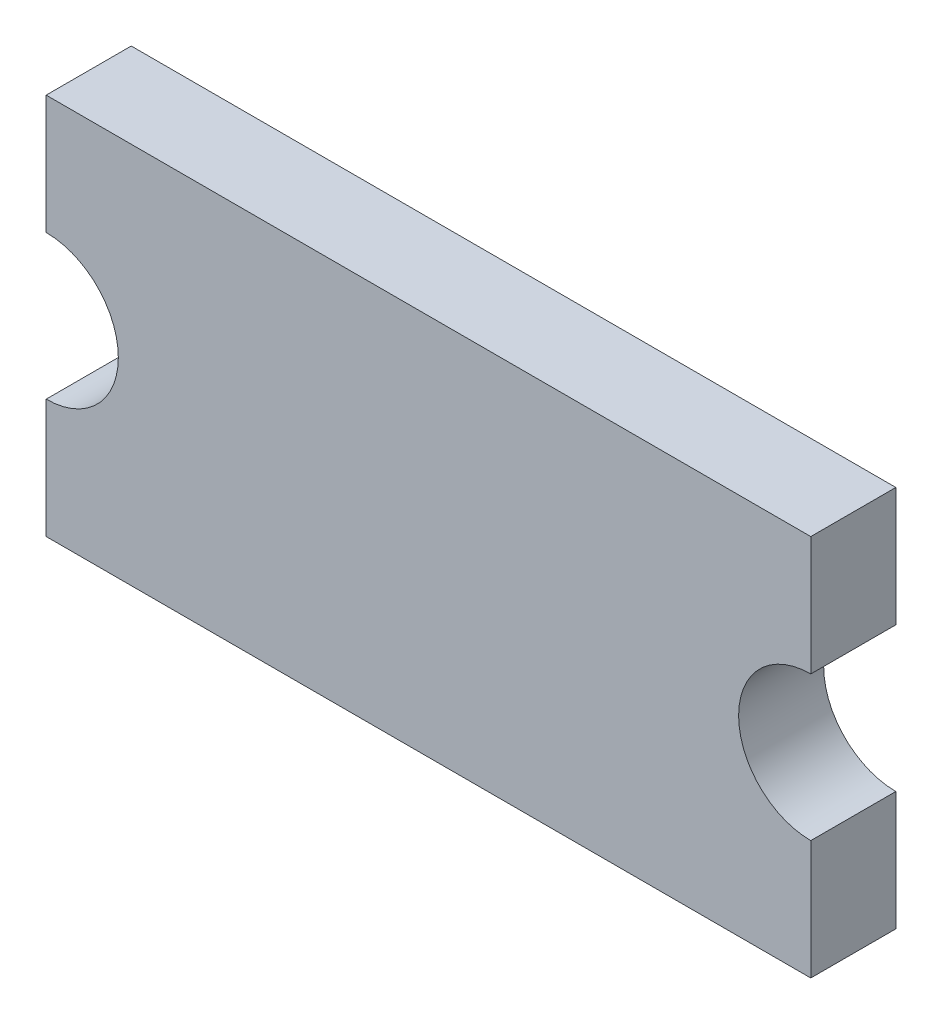
ISO-10303-21;
HEADER;
FILE_DESCRIPTION(('STEP AP214'),'2;1');
FILE_NAME('part.step','',(''),(''),'','','');
FILE_SCHEMA(('AUTOMOTIVE_DESIGN { 1 0 10303 214 1 1 1 1 }'));
ENDSEC;
DATA;
#1=APPLICATION_CONTEXT('core data for automotive mechanical design processes');
#2=APPLICATION_PROTOCOL_DEFINITION('international standard','automotive_design',2000,#1);
#3=PRODUCT_CONTEXT('',#1,'mechanical');
#4=PRODUCT('Part','Part','',(#3));
#5=PRODUCT_RELATED_PRODUCT_CATEGORY('part','',(#4));
#6=PRODUCT_DEFINITION_FORMATION('','',#4);
#7=PRODUCT_DEFINITION_CONTEXT('part definition',#1,'design');
#8=PRODUCT_DEFINITION('design','',#6,#7);
#9=PRODUCT_DEFINITION_SHAPE('','',#8);
#10=(LENGTH_UNIT() NAMED_UNIT(*) SI_UNIT(.MILLI.,.METRE.));
#11=(NAMED_UNIT(*) PLANE_ANGLE_UNIT() SI_UNIT($,.RADIAN.));
#12=(NAMED_UNIT(*) SI_UNIT($,.STERADIAN.) SOLID_ANGLE_UNIT());
#13=UNCERTAINTY_MEASURE_WITH_UNIT(LENGTH_MEASURE(1.E-05),#10,'distance_accuracy_value','');
#14=(GEOMETRIC_REPRESENTATION_CONTEXT(3) GLOBAL_UNCERTAINTY_ASSIGNED_CONTEXT((#13)) GLOBAL_UNIT_ASSIGNED_CONTEXT((#10,
#11,#12)) REPRESENTATION_CONTEXT('',''));
#15=CARTESIAN_POINT('',(0.,0.,0.));
#16=DIRECTION('',(0.,0.,1.));
#17=DIRECTION('',(1.,0.,0.));
#18=AXIS2_PLACEMENT_3D('',#15,#16,#17);
#19=CARTESIAN_POINT('',(0.,0.,0.178));
#20=DIRECTION('',(0.,0.,1.));
#21=DIRECTION('',(1.,0.,0.));
#22=AXIS2_PLACEMENT_3D('',#19,#20,#21);
#23=PLANE('',#22);
#24=DIRECTION('',(-1.,0.,0.));
#25=VECTOR('',#24,1.);
#26=CARTESIAN_POINT('',(-0.8,0.4,0.178));
#27=LINE('',#26,#25);
#28=CARTESIAN_POINT('',(0.8,0.4,0.178));
#29=VERTEX_POINT('',#28);
#30=CARTESIAN_POINT('',(-0.8,0.4,0.178));
#31=VERTEX_POINT('',#30);
#32=EDGE_CURVE('E11',#29,#31,#27,.T.);
#33=ORIENTED_EDGE('',*,*,#32,.T.);
#34=DIRECTION('',(0.,-1.,0.));
#35=VECTOR('',#34,1.);
#36=CARTESIAN_POINT('',(-0.8,0.151,0.178));
#37=LINE('',#36,#35);
#38=CARTESIAN_POINT('',(-0.8,0.151,0.178));
#39=VERTEX_POINT('',#38);
#40=EDGE_CURVE('E187',#31,#39,#37,.T.);
#41=ORIENTED_EDGE('',*,*,#40,.T.);
#42=CARTESIAN_POINT('',(-0.8,0.,0.178));
#43=DIRECTION('',(0.,0.,-1.));
#44=DIRECTION('',(0.,-1.,0.));
#45=AXIS2_PLACEMENT_3D('',#42,#43,#44);
#46=CIRCLE('',#45,0.151);
#47=CARTESIAN_POINT('',(-0.8,-0.151,0.178));
#48=VERTEX_POINT('',#47);
#49=EDGE_CURVE('E128',#39,#48,#46,.T.);
#50=ORIENTED_EDGE('',*,*,#49,.T.);
#51=DIRECTION('',(0.,-1.,0.));
#52=VECTOR('',#51,1.);
#53=CARTESIAN_POINT('',(-0.8,-0.4,0.178));
#54=LINE('',#53,#52);
#55=CARTESIAN_POINT('',(-0.8,-0.4,0.178));
#56=VERTEX_POINT('',#55);
#57=EDGE_CURVE('E133',#48,#56,#54,.T.);
#58=ORIENTED_EDGE('',*,*,#57,.T.);
#59=DIRECTION('',(1.,0.,0.));
#60=VECTOR('',#59,1.);
#61=CARTESIAN_POINT('',(0.8,-0.4,0.178));
#62=LINE('',#61,#60);
#63=CARTESIAN_POINT('',(0.8,-0.4,0.178));
#64=VERTEX_POINT('',#63);
#65=EDGE_CURVE('E149',#56,#64,#62,.T.);
#66=ORIENTED_EDGE('',*,*,#65,.T.);
#67=DIRECTION('',(0.,1.,0.));
#68=VECTOR('',#67,1.);
#69=CARTESIAN_POINT('',(0.8,-0.151,0.178));
#70=LINE('',#69,#68);
#71=CARTESIAN_POINT('',(0.8,-0.151,0.178));
#72=VERTEX_POINT('',#71);
#73=EDGE_CURVE('E158',#64,#72,#70,.T.);
#74=ORIENTED_EDGE('',*,*,#73,.T.);
#75=CARTESIAN_POINT('',(0.8,0.,0.178));
#76=DIRECTION('',(0.,0.,-1.));
#77=DIRECTION('',(0.,1.,0.));
#78=AXIS2_PLACEMENT_3D('',#75,#76,#77);
#79=CIRCLE('',#78,0.151);
#80=CARTESIAN_POINT('',(0.8,0.151,0.178));
#81=VERTEX_POINT('',#80);
#82=EDGE_CURVE('E145',#72,#81,#79,.T.);
#83=ORIENTED_EDGE('',*,*,#82,.T.);
#84=DIRECTION('',(0.,1.,0.));
#85=VECTOR('',#84,1.);
#86=CARTESIAN_POINT('',(0.8,0.4,0.178));
#87=LINE('',#86,#85);
#88=EDGE_CURVE('E116',#81,#29,#87,.T.);
#89=ORIENTED_EDGE('',*,*,#88,.T.);
#90=EDGE_LOOP('',(#33,#41,#50,#58,#66,#74,#83,#89));
#91=FACE_BOUND('',#90,.T.);
#92=ADVANCED_FACE('F17',(#91),#23,.T.);
#93=CARTESIAN_POINT('',(0.,0.,0.));
#94=DIRECTION('',(0.,0.,1.));
#95=DIRECTION('',(1.,0.,0.));
#96=AXIS2_PLACEMENT_3D('',#93,#94,#95);
#97=PLANE('',#96);
#98=DIRECTION('',(1.,0.,0.));
#99=VECTOR('',#98,1.);
#100=CARTESIAN_POINT('',(-0.8,0.4,0.));
#101=LINE('',#100,#99);
#102=CARTESIAN_POINT('',(-0.8,0.4,0.));
#103=VERTEX_POINT('',#102);
#104=CARTESIAN_POINT('',(0.8,0.4,0.));
#105=VERTEX_POINT('',#104);
#106=EDGE_CURVE('E26',#103,#105,#101,.T.);
#107=ORIENTED_EDGE('',*,*,#106,.T.);
#108=DIRECTION('',(0.,-1.,0.));
#109=VECTOR('',#108,1.);
#110=CARTESIAN_POINT('',(0.8,0.4,0.));
#111=LINE('',#110,#109);
#112=CARTESIAN_POINT('',(0.8,0.151,0.));
#113=VERTEX_POINT('',#112);
#114=EDGE_CURVE('E104',#105,#113,#111,.T.);
#115=ORIENTED_EDGE('',*,*,#114,.T.);
#116=CARTESIAN_POINT('',(0.8,0.,0.));
#117=DIRECTION('',(0.,0.,1.));
#118=DIRECTION('',(0.,1.,0.));
#119=AXIS2_PLACEMENT_3D('',#116,#117,#118);
#120=CIRCLE('',#119,0.151);
#121=CARTESIAN_POINT('',(0.8,-0.151,0.));
#122=VERTEX_POINT('',#121);
#123=EDGE_CURVE('E142',#113,#122,#120,.T.);
#124=ORIENTED_EDGE('',*,*,#123,.T.);
#125=DIRECTION('',(0.,-1.,0.));
#126=VECTOR('',#125,1.);
#127=CARTESIAN_POINT('',(0.8,-0.151,0.));
#128=LINE('',#127,#126);
#129=CARTESIAN_POINT('',(0.8,-0.4,0.));
#130=VERTEX_POINT('',#129);
#131=EDGE_CURVE('E154',#122,#130,#128,.T.);
#132=ORIENTED_EDGE('',*,*,#131,.T.);
#133=DIRECTION('',(-1.,0.,0.));
#134=VECTOR('',#133,1.);
#135=CARTESIAN_POINT('',(0.8,-0.4,0.));
#136=LINE('',#135,#134);
#137=CARTESIAN_POINT('',(-0.8,-0.4,0.));
#138=VERTEX_POINT('',#137);
#139=EDGE_CURVE('E153',#130,#138,#136,.T.);
#140=ORIENTED_EDGE('',*,*,#139,.T.);
#141=DIRECTION('',(0.,1.,0.));
#142=VECTOR('',#141,1.);
#143=CARTESIAN_POINT('',(-0.8,-0.4,0.));
#144=LINE('',#143,#142);
#145=CARTESIAN_POINT('',(-0.8,-0.151,0.));
#146=VERTEX_POINT('',#145);
#147=EDGE_CURVE('E137',#138,#146,#144,.T.);
#148=ORIENTED_EDGE('',*,*,#147,.T.);
#149=CARTESIAN_POINT('',(-0.8,0.,0.));
#150=DIRECTION('',(0.,0.,1.));
#151=DIRECTION('',(0.,-1.,0.));
#152=AXIS2_PLACEMENT_3D('',#149,#150,#151);
#153=CIRCLE('',#152,0.151);
#154=CARTESIAN_POINT('',(-0.8,0.151,0.));
#155=VERTEX_POINT('',#154);
#156=EDGE_CURVE('E131',#146,#155,#153,.T.);
#157=ORIENTED_EDGE('',*,*,#156,.T.);
#158=DIRECTION('',(0.,1.,0.));
#159=VECTOR('',#158,1.);
#160=CARTESIAN_POINT('',(-0.8,0.151,0.));
#161=LINE('',#160,#159);
#162=EDGE_CURVE('E106',#155,#103,#161,.T.);
#163=ORIENTED_EDGE('',*,*,#162,.T.);
#164=EDGE_LOOP('',(#107,#115,#124,#132,#140,#148,#157,#163));
#165=FACE_BOUND('',#164,.T.);
#166=ADVANCED_FACE('F19',(#165),#97,.F.);
#167=CARTESIAN_POINT('',(0.8,0.4,0.));
#168=DIRECTION('',(0.,1.,0.));
#169=DIRECTION('',(1.,0.,0.));
#170=AXIS2_PLACEMENT_3D('',#167,#168,#169);
#171=PLANE('',#170);
#172=ORIENTED_EDGE('',*,*,#106,.F.);
#173=DIRECTION('',(0.,0.,1.));
#174=VECTOR('',#173,1.);
#175=CARTESIAN_POINT('',(-0.8,0.4,0.));
#176=LINE('',#175,#174);
#177=EDGE_CURVE('E108',#103,#31,#176,.T.);
#178=ORIENTED_EDGE('',*,*,#177,.T.);
#179=ORIENTED_EDGE('',*,*,#32,.F.);
#180=DIRECTION('',(0.,0.,1.));
#181=VECTOR('',#180,1.);
#182=CARTESIAN_POINT('',(0.8,0.4,0.));
#183=LINE('',#182,#181);
#184=EDGE_CURVE('E111',#105,#29,#183,.T.);
#185=ORIENTED_EDGE('',*,*,#184,.F.);
#186=EDGE_LOOP('',(#172,#178,#179,#185));
#187=FACE_BOUND('',#186,.T.);
#188=ADVANCED_FACE('F112',(#187),#171,.T.);
#189=CARTESIAN_POINT('',(-0.8,0.4,0.));
#190=DIRECTION('',(-1.,0.,0.));
#191=DIRECTION('',(0.,1.,0.));
#192=AXIS2_PLACEMENT_3D('',#189,#190,#191);
#193=PLANE('',#192);
#194=ORIENTED_EDGE('',*,*,#162,.F.);
#195=DIRECTION('',(0.,0.,1.));
#196=VECTOR('',#195,1.);
#197=CARTESIAN_POINT('',(-0.8,0.151,0.));
#198=LINE('',#197,#196);
#199=EDGE_CURVE('E130',#155,#39,#198,.T.);
#200=ORIENTED_EDGE('',*,*,#199,.T.);
#201=ORIENTED_EDGE('',*,*,#40,.F.);
#202=ORIENTED_EDGE('',*,*,#177,.F.);
#203=EDGE_LOOP('',(#194,#200,#201,#202));
#204=FACE_BOUND('',#203,.T.);
#205=ADVANCED_FACE('F194',(#204),#193,.T.);
#206=CARTESIAN_POINT('',(-0.8,0.,0.));
#207=DIRECTION('',(0.,0.,1.));
#208=DIRECTION('',(0.,-1.,0.));
#209=AXIS2_PLACEMENT_3D('',#206,#207,#208);
#210=CYLINDRICAL_SURFACE('',#209,0.151);
#211=ORIENTED_EDGE('',*,*,#156,.F.);
#212=DIRECTION('',(0.,0.,1.));
#213=VECTOR('',#212,1.);
#214=CARTESIAN_POINT('',(-0.8,-0.151,0.));
#215=LINE('',#214,#213);
#216=EDGE_CURVE('E136',#146,#48,#215,.T.);
#217=ORIENTED_EDGE('',*,*,#216,.T.);
#218=ORIENTED_EDGE('',*,*,#49,.F.);
#219=ORIENTED_EDGE('',*,*,#199,.F.);
#220=EDGE_LOOP('',(#211,#217,#218,#219));
#221=FACE_BOUND('',#220,.T.);
#222=ADVANCED_FACE('F200',(#221),#210,.F.);
#223=CARTESIAN_POINT('',(-0.8,-0.151,0.));
#224=DIRECTION('',(-1.,0.,0.));
#225=DIRECTION('',(0.,0.,1.));
#226=AXIS2_PLACEMENT_3D('',#223,#224,#225);
#227=PLANE('',#226);
#228=ORIENTED_EDGE('',*,*,#147,.F.);
#229=DIRECTION('',(0.,0.,1.));
#230=VECTOR('',#229,1.);
#231=CARTESIAN_POINT('',(-0.8,-0.4,0.));
#232=LINE('',#231,#230);
#233=EDGE_CURVE('E152',#138,#56,#232,.T.);
#234=ORIENTED_EDGE('',*,*,#233,.T.);
#235=ORIENTED_EDGE('',*,*,#57,.F.);
#236=ORIENTED_EDGE('',*,*,#216,.F.);
#237=EDGE_LOOP('',(#228,#234,#235,#236));
#238=FACE_BOUND('',#237,.T.);
#239=ADVANCED_FACE('F202',(#238),#227,.T.);
#240=CARTESIAN_POINT('',(-0.8,-0.4,0.));
#241=DIRECTION('',(0.,-1.,0.));
#242=DIRECTION('',(0.,0.,-1.));
#243=AXIS2_PLACEMENT_3D('',#240,#241,#242);
#244=PLANE('',#243);
#245=ORIENTED_EDGE('',*,*,#139,.F.);
#246=DIRECTION('',(0.,0.,1.));
#247=VECTOR('',#246,1.);
#248=CARTESIAN_POINT('',(0.8,-0.4,0.));
#249=LINE('',#248,#247);
#250=EDGE_CURVE('E167',#130,#64,#249,.T.);
#251=ORIENTED_EDGE('',*,*,#250,.T.);
#252=ORIENTED_EDGE('',*,*,#65,.F.);
#253=ORIENTED_EDGE('',*,*,#233,.F.);
#254=EDGE_LOOP('',(#245,#251,#252,#253));
#255=FACE_BOUND('',#254,.T.);
#256=ADVANCED_FACE('F206',(#255),#244,.T.);
#257=CARTESIAN_POINT('',(0.8,-0.4,0.));
#258=DIRECTION('',(1.,0.,0.));
#259=DIRECTION('',(0.,1.,0.));
#260=AXIS2_PLACEMENT_3D('',#257,#258,#259);
#261=PLANE('',#260);
#262=ORIENTED_EDGE('',*,*,#131,.F.);
#263=DIRECTION('',(0.,0.,1.));
#264=VECTOR('',#263,1.);
#265=CARTESIAN_POINT('',(0.8,-0.151,0.));
#266=LINE('',#265,#264);
#267=EDGE_CURVE('E148',#122,#72,#266,.T.);
#268=ORIENTED_EDGE('',*,*,#267,.T.);
#269=ORIENTED_EDGE('',*,*,#73,.F.);
#270=ORIENTED_EDGE('',*,*,#250,.F.);
#271=EDGE_LOOP('',(#262,#268,#269,#270));
#272=FACE_BOUND('',#271,.T.);
#273=ADVANCED_FACE('F212',(#272),#261,.T.);
#274=CARTESIAN_POINT('',(0.8,0.,0.));
#275=DIRECTION('',(0.,0.,1.));
#276=DIRECTION('',(0.,1.,0.));
#277=AXIS2_PLACEMENT_3D('',#274,#275,#276);
#278=CYLINDRICAL_SURFACE('',#277,0.151);
#279=ORIENTED_EDGE('',*,*,#123,.F.);
#280=DIRECTION('',(0.,0.,1.));
#281=VECTOR('',#280,1.);
#282=CARTESIAN_POINT('',(0.8,0.151,0.));
#283=LINE('',#282,#281);
#284=EDGE_CURVE('E121',#113,#81,#283,.T.);
#285=ORIENTED_EDGE('',*,*,#284,.T.);
#286=ORIENTED_EDGE('',*,*,#82,.F.);
#287=ORIENTED_EDGE('',*,*,#267,.F.);
#288=EDGE_LOOP('',(#279,#285,#286,#287));
#289=FACE_BOUND('',#288,.T.);
#290=ADVANCED_FACE('F214',(#289),#278,.F.);
#291=CARTESIAN_POINT('',(0.8,0.151,0.));
#292=DIRECTION('',(1.,0.,0.));
#293=DIRECTION('',(0.,1.,0.));
#294=AXIS2_PLACEMENT_3D('',#291,#292,#293);
#295=PLANE('',#294);
#296=ORIENTED_EDGE('',*,*,#114,.F.);
#297=ORIENTED_EDGE('',*,*,#184,.T.);
#298=ORIENTED_EDGE('',*,*,#88,.F.);
#299=ORIENTED_EDGE('',*,*,#284,.F.);
#300=EDGE_LOOP('',(#296,#297,#298,#299));
#301=FACE_BOUND('',#300,.T.);
#302=ADVANCED_FACE('F119',(#301),#295,.T.);
#303=CLOSED_SHELL('',(#92,#166,#188,#205,#222,#239,#256,#273,#290,#302));
#304=MANIFOLD_SOLID_BREP('B1',#303);
#305=ADVANCED_BREP_SHAPE_REPRESENTATION('',(#18,#304),#14);
#306=SHAPE_DEFINITION_REPRESENTATION(#9,#305);
ENDSEC;
END-ISO-10303-21;
